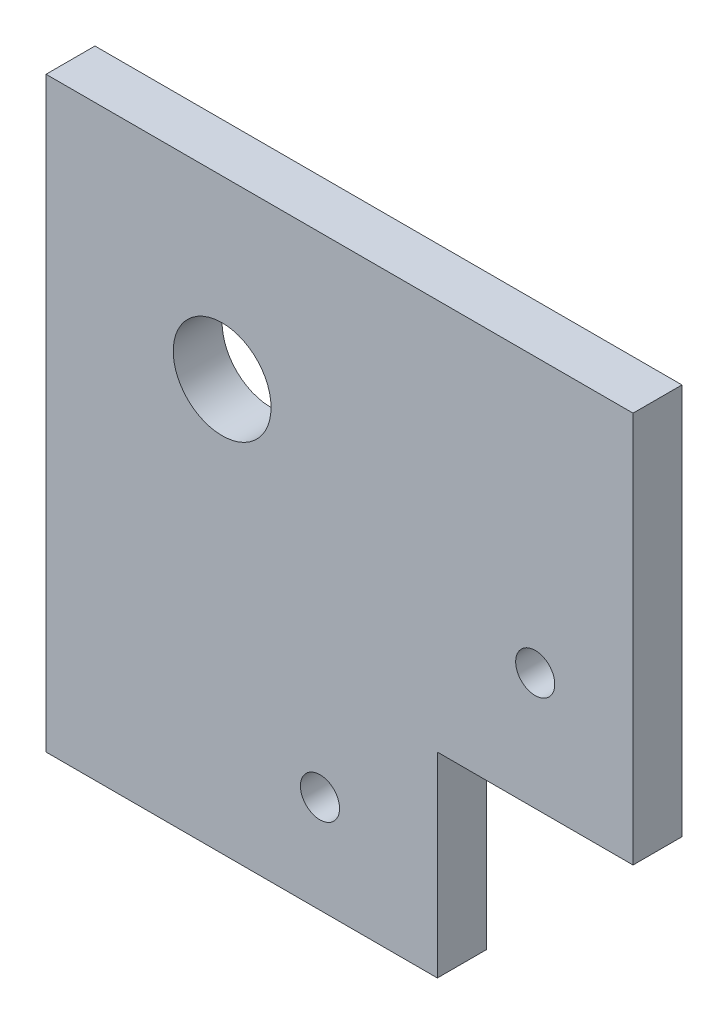
ISO-10303-21;
HEADER;
FILE_DESCRIPTION(('STEP AP214'),'2;1');
FILE_NAME('part.step','',(''),(''),'','','');
FILE_SCHEMA(('AUTOMOTIVE_DESIGN { 1 0 10303 214 1 1 1 1 }'));
ENDSEC;
DATA;
#1=APPLICATION_CONTEXT('core data for automotive mechanical design processes');
#2=APPLICATION_PROTOCOL_DEFINITION('international standard','automotive_design',2000,#1);
#3=PRODUCT_CONTEXT('',#1,'mechanical');
#4=PRODUCT('Part','Part','',(#3));
#5=PRODUCT_RELATED_PRODUCT_CATEGORY('part','',(#4));
#6=PRODUCT_DEFINITION_FORMATION('','',#4);
#7=PRODUCT_DEFINITION_CONTEXT('part definition',#1,'design');
#8=PRODUCT_DEFINITION('design','',#6,#7);
#9=PRODUCT_DEFINITION_SHAPE('','',#8);
#10=(LENGTH_UNIT() NAMED_UNIT(*) SI_UNIT(.MILLI.,.METRE.));
#11=(NAMED_UNIT(*) PLANE_ANGLE_UNIT() SI_UNIT($,.RADIAN.));
#12=(NAMED_UNIT(*) SI_UNIT($,.STERADIAN.) SOLID_ANGLE_UNIT());
#13=UNCERTAINTY_MEASURE_WITH_UNIT(LENGTH_MEASURE(1.E-05),#10,'distance_accuracy_value','');
#14=(GEOMETRIC_REPRESENTATION_CONTEXT(3) GLOBAL_UNCERTAINTY_ASSIGNED_CONTEXT((#13)) GLOBAL_UNIT_ASSIGNED_CONTEXT((#10,
#11,#12)) REPRESENTATION_CONTEXT('',''));
#15=CARTESIAN_POINT('',(0.,0.,0.));
#16=DIRECTION('',(0.,0.,1.));
#17=DIRECTION('',(1.,0.,0.));
#18=AXIS2_PLACEMENT_3D('',#15,#16,#17);
#19=CARTESIAN_POINT('',(0.,0.,5.));
#20=DIRECTION('',(0.,0.,-1.));
#21=DIRECTION('',(-1.,0.,0.));
#22=AXIS2_PLACEMENT_3D('',#19,#20,#21);
#23=PLANE('',#22);
#24=CARTESIAN_POINT('',(50.,32.,5.));
#25=DIRECTION('',(0.,0.,-1.));
#26=DIRECTION('',(-1.,0.,0.));
#27=AXIS2_PLACEMENT_3D('',#24,#25,#26);
#28=CIRCLE('',#27,2.);
#29=CARTESIAN_POINT('',(48.,32.,5.));
#30=VERTEX_POINT('',#29);
#31=EDGE_CURVE('E179',#30,#30,#28,.T.);
#32=ORIENTED_EDGE('',*,*,#31,.T.);
#33=EDGE_LOOP('',(#32));
#34=FACE_BOUND('',#33,.T.);
#35=CARTESIAN_POINT('',(28.,10.,5.));
#36=DIRECTION('',(0.,0.,-1.));
#37=DIRECTION('',(-1.,0.,0.));
#38=AXIS2_PLACEMENT_3D('',#35,#36,#37);
#39=CIRCLE('',#38,2.);
#40=CARTESIAN_POINT('',(26.,10.,5.));
#41=VERTEX_POINT('',#40);
#42=EDGE_CURVE('E183',#41,#41,#39,.T.);
#43=ORIENTED_EDGE('',*,*,#42,.T.);
#44=EDGE_LOOP('',(#43));
#45=FACE_BOUND('',#44,.T.);
#46=DIRECTION('',(0.,-1.,0.));
#47=VECTOR('',#46,1.);
#48=CARTESIAN_POINT('',(0.,0.,5.));
#49=LINE('',#48,#47);
#50=CARTESIAN_POINT('',(0.,60.,5.));
#51=VERTEX_POINT('',#50);
#52=CARTESIAN_POINT('',(0.,0.,5.));
#53=VERTEX_POINT('',#52);
#54=EDGE_CURVE('E132',#51,#53,#49,.T.);
#55=ORIENTED_EDGE('',*,*,#54,.T.);
#56=DIRECTION('',(1.,0.,0.));
#57=VECTOR('',#56,1.);
#58=CARTESIAN_POINT('',(0.,0.,5.));
#59=LINE('',#58,#57);
#60=CARTESIAN_POINT('',(40.,0.,5.));
#61=VERTEX_POINT('',#60);
#62=EDGE_CURVE('E90',#53,#61,#59,.T.);
#63=ORIENTED_EDGE('',*,*,#62,.T.);
#64=DIRECTION('',(0.,1.,0.));
#65=VECTOR('',#64,1.);
#66=CARTESIAN_POINT('',(40.,0.,5.));
#67=LINE('',#66,#65);
#68=CARTESIAN_POINT('',(40.,20.,5.));
#69=VERTEX_POINT('',#68);
#70=EDGE_CURVE('E103',#61,#69,#67,.T.);
#71=ORIENTED_EDGE('',*,*,#70,.T.);
#72=DIRECTION('',(1.,0.,0.));
#73=VECTOR('',#72,1.);
#74=CARTESIAN_POINT('',(60.,20.,5.));
#75=LINE('',#74,#73);
#76=CARTESIAN_POINT('',(60.,20.,5.));
#77=VERTEX_POINT('',#76);
#78=EDGE_CURVE('E97',#69,#77,#75,.T.);
#79=ORIENTED_EDGE('',*,*,#78,.T.);
#80=DIRECTION('',(0.,1.,0.));
#81=VECTOR('',#80,1.);
#82=CARTESIAN_POINT('',(60.,20.,5.));
#83=LINE('',#82,#81);
#84=CARTESIAN_POINT('',(60.,60.,5.));
#85=VERTEX_POINT('',#84);
#86=EDGE_CURVE('E101',#77,#85,#83,.T.);
#87=ORIENTED_EDGE('',*,*,#86,.T.);
#88=DIRECTION('',(-1.,0.,0.));
#89=VECTOR('',#88,1.);
#90=CARTESIAN_POINT('',(0.,60.,5.));
#91=LINE('',#90,#89);
#92=EDGE_CURVE('E53',#85,#51,#91,.T.);
#93=ORIENTED_EDGE('',*,*,#92,.T.);
#94=EDGE_LOOP('',(#55,#63,#71,#79,#87,#93));
#95=FACE_BOUND('',#94,.T.);
#96=CARTESIAN_POINT('',(18.,42.,5.));
#97=DIRECTION('',(0.,0.,1.));
#98=DIRECTION('',(1.,0.,0.));
#99=AXIS2_PLACEMENT_3D('',#96,#97,#98);
#100=CIRCLE('',#99,5.);
#101=CARTESIAN_POINT('',(23.,42.,5.));
#102=VERTEX_POINT('',#101);
#103=EDGE_CURVE('E125',#102,#102,#100,.T.);
#104=ORIENTED_EDGE('',*,*,#103,.F.);
#105=EDGE_LOOP('',(#104));
#106=FACE_BOUND('',#105,.T.);
#107=ADVANCED_FACE('F36',(#34,#45,#95,#106),#23,.F.);
#108=CARTESIAN_POINT('',(0.,0.,0.));
#109=DIRECTION('',(0.,0.,-1.));
#110=DIRECTION('',(-1.,0.,0.));
#111=AXIS2_PLACEMENT_3D('',#108,#109,#110);
#112=PLANE('',#111);
#113=CARTESIAN_POINT('',(50.,32.,0.));
#114=DIRECTION('',(0.,0.,-1.));
#115=DIRECTION('',(-1.,0.,0.));
#116=AXIS2_PLACEMENT_3D('',#113,#114,#115);
#117=CIRCLE('',#116,2.);
#118=CARTESIAN_POINT('',(48.,32.,0.));
#119=VERTEX_POINT('',#118);
#120=EDGE_CURVE('E182',#119,#119,#117,.T.);
#121=ORIENTED_EDGE('',*,*,#120,.F.);
#122=EDGE_LOOP('',(#121));
#123=FACE_BOUND('',#122,.T.);
#124=CARTESIAN_POINT('',(28.,10.,0.));
#125=DIRECTION('',(0.,0.,-1.));
#126=DIRECTION('',(-1.,0.,0.));
#127=AXIS2_PLACEMENT_3D('',#124,#125,#126);
#128=CIRCLE('',#127,2.);
#129=CARTESIAN_POINT('',(26.,10.,0.));
#130=VERTEX_POINT('',#129);
#131=EDGE_CURVE('E188',#130,#130,#128,.T.);
#132=ORIENTED_EDGE('',*,*,#131,.F.);
#133=EDGE_LOOP('',(#132));
#134=FACE_BOUND('',#133,.T.);
#135=DIRECTION('',(0.,-1.,0.));
#136=VECTOR('',#135,1.);
#137=CARTESIAN_POINT('',(0.,0.,0.));
#138=LINE('',#137,#136);
#139=CARTESIAN_POINT('',(0.,60.,0.));
#140=VERTEX_POINT('',#139);
#141=CARTESIAN_POINT('',(0.,0.,0.));
#142=VERTEX_POINT('',#141);
#143=EDGE_CURVE('E121',#140,#142,#138,.T.);
#144=ORIENTED_EDGE('',*,*,#143,.F.);
#145=DIRECTION('',(-1.,0.,0.));
#146=VECTOR('',#145,1.);
#147=CARTESIAN_POINT('',(0.,60.,0.));
#148=LINE('',#147,#146);
#149=CARTESIAN_POINT('',(60.,60.,0.));
#150=VERTEX_POINT('',#149);
#151=EDGE_CURVE('E82',#150,#140,#148,.T.);
#152=ORIENTED_EDGE('',*,*,#151,.F.);
#153=DIRECTION('',(0.,1.,0.));
#154=VECTOR('',#153,1.);
#155=CARTESIAN_POINT('',(60.,20.,0.));
#156=LINE('',#155,#154);
#157=CARTESIAN_POINT('',(60.,20.,0.));
#158=VERTEX_POINT('',#157);
#159=EDGE_CURVE('E76',#158,#150,#156,.T.);
#160=ORIENTED_EDGE('',*,*,#159,.F.);
#161=DIRECTION('',(1.,0.,0.));
#162=VECTOR('',#161,1.);
#163=CARTESIAN_POINT('',(60.,20.,0.));
#164=LINE('',#163,#162);
#165=CARTESIAN_POINT('',(40.,20.,0.));
#166=VERTEX_POINT('',#165);
#167=EDGE_CURVE('E111',#166,#158,#164,.T.);
#168=ORIENTED_EDGE('',*,*,#167,.F.);
#169=DIRECTION('',(0.,1.,0.));
#170=VECTOR('',#169,1.);
#171=CARTESIAN_POINT('',(40.,0.,0.));
#172=LINE('',#171,#170);
#173=CARTESIAN_POINT('',(40.,0.,0.));
#174=VERTEX_POINT('',#173);
#175=EDGE_CURVE('E127',#174,#166,#172,.T.);
#176=ORIENTED_EDGE('',*,*,#175,.F.);
#177=DIRECTION('',(1.,0.,0.));
#178=VECTOR('',#177,1.);
#179=CARTESIAN_POINT('',(0.,0.,0.));
#180=LINE('',#179,#178);
#181=EDGE_CURVE('E124',#142,#174,#180,.T.);
#182=ORIENTED_EDGE('',*,*,#181,.F.);
#183=EDGE_LOOP('',(#144,#152,#160,#168,#176,#182));
#184=FACE_BOUND('',#183,.T.);
#185=CARTESIAN_POINT('',(18.,42.,0.));
#186=DIRECTION('',(0.,0.,1.));
#187=DIRECTION('',(1.,0.,0.));
#188=AXIS2_PLACEMENT_3D('',#185,#186,#187);
#189=CIRCLE('',#188,5.);
#190=CARTESIAN_POINT('',(23.,42.,0.));
#191=VERTEX_POINT('',#190);
#192=EDGE_CURVE('E185',#191,#191,#189,.T.);
#193=ORIENTED_EDGE('',*,*,#192,.T.);
#194=EDGE_LOOP('',(#193));
#195=FACE_BOUND('',#194,.T.);
#196=ADVANCED_FACE('F141',(#123,#134,#184,#195),#112,.T.);
#197=CARTESIAN_POINT('',(0.,0.,5.));
#198=DIRECTION('',(1.,0.,0.));
#199=DIRECTION('',(0.,0.,-1.));
#200=AXIS2_PLACEMENT_3D('',#197,#198,#199);
#201=PLANE('',#200);
#202=ORIENTED_EDGE('',*,*,#143,.T.);
#203=DIRECTION('',(0.,0.,-1.));
#204=VECTOR('',#203,1.);
#205=CARTESIAN_POINT('',(0.,0.,5.));
#206=LINE('',#205,#204);
#207=EDGE_CURVE('E11',#53,#142,#206,.T.);
#208=ORIENTED_EDGE('',*,*,#207,.F.);
#209=ORIENTED_EDGE('',*,*,#54,.F.);
#210=DIRECTION('',(0.,0.,-1.));
#211=VECTOR('',#210,1.);
#212=CARTESIAN_POINT('',(0.,60.,5.));
#213=LINE('',#212,#211);
#214=EDGE_CURVE('E117',#51,#140,#213,.T.);
#215=ORIENTED_EDGE('',*,*,#214,.T.);
#216=EDGE_LOOP('',(#202,#208,#209,#215));
#217=FACE_BOUND('',#216,.T.);
#218=ADVANCED_FACE('F38',(#217),#201,.F.);
#219=CARTESIAN_POINT('',(0.,0.,5.));
#220=DIRECTION('',(0.,1.,0.));
#221=DIRECTION('',(-1.,0.,0.));
#222=AXIS2_PLACEMENT_3D('',#219,#220,#221);
#223=PLANE('',#222);
#224=ORIENTED_EDGE('',*,*,#181,.T.);
#225=DIRECTION('',(0.,0.,-1.));
#226=VECTOR('',#225,1.);
#227=CARTESIAN_POINT('',(40.,0.,5.));
#228=LINE('',#227,#226);
#229=EDGE_CURVE('E45',#61,#174,#228,.T.);
#230=ORIENTED_EDGE('',*,*,#229,.F.);
#231=ORIENTED_EDGE('',*,*,#62,.F.);
#232=ORIENTED_EDGE('',*,*,#207,.T.);
#233=EDGE_LOOP('',(#224,#230,#231,#232));
#234=FACE_BOUND('',#233,.T.);
#235=ADVANCED_FACE('F235',(#234),#223,.F.);
#236=CARTESIAN_POINT('',(40.,0.,5.));
#237=DIRECTION('',(-1.,0.,0.));
#238=DIRECTION('',(0.,0.,1.));
#239=AXIS2_PLACEMENT_3D('',#236,#237,#238);
#240=PLANE('',#239);
#241=ORIENTED_EDGE('',*,*,#175,.T.);
#242=DIRECTION('',(0.,0.,-1.));
#243=VECTOR('',#242,1.);
#244=CARTESIAN_POINT('',(40.,20.,5.));
#245=LINE('',#244,#243);
#246=EDGE_CURVE('E112',#69,#166,#245,.T.);
#247=ORIENTED_EDGE('',*,*,#246,.F.);
#248=ORIENTED_EDGE('',*,*,#70,.F.);
#249=ORIENTED_EDGE('',*,*,#229,.T.);
#250=EDGE_LOOP('',(#241,#247,#248,#249));
#251=FACE_BOUND('',#250,.T.);
#252=ADVANCED_FACE('F138',(#251),#240,.F.);
#253=CARTESIAN_POINT('',(60.,20.,5.));
#254=DIRECTION('',(0.,1.,0.));
#255=DIRECTION('',(-1.,0.,0.));
#256=AXIS2_PLACEMENT_3D('',#253,#254,#255);
#257=PLANE('',#256);
#258=ORIENTED_EDGE('',*,*,#167,.T.);
#259=DIRECTION('',(0.,0.,-1.));
#260=VECTOR('',#259,1.);
#261=CARTESIAN_POINT('',(60.,20.,5.));
#262=LINE('',#261,#260);
#263=EDGE_CURVE('E108',#77,#158,#262,.T.);
#264=ORIENTED_EDGE('',*,*,#263,.F.);
#265=ORIENTED_EDGE('',*,*,#78,.F.);
#266=ORIENTED_EDGE('',*,*,#246,.T.);
#267=EDGE_LOOP('',(#258,#264,#265,#266));
#268=FACE_BOUND('',#267,.T.);
#269=ADVANCED_FACE('F109',(#268),#257,.F.);
#270=CARTESIAN_POINT('',(60.,20.,5.));
#271=DIRECTION('',(-1.,0.,0.));
#272=DIRECTION('',(0.,0.,1.));
#273=AXIS2_PLACEMENT_3D('',#270,#271,#272);
#274=PLANE('',#273);
#275=ORIENTED_EDGE('',*,*,#159,.T.);
#276=DIRECTION('',(0.,0.,-1.));
#277=VECTOR('',#276,1.);
#278=CARTESIAN_POINT('',(60.,60.,5.));
#279=LINE('',#278,#277);
#280=EDGE_CURVE('E113',#85,#150,#279,.T.);
#281=ORIENTED_EDGE('',*,*,#280,.F.);
#282=ORIENTED_EDGE('',*,*,#86,.F.);
#283=ORIENTED_EDGE('',*,*,#263,.T.);
#284=EDGE_LOOP('',(#275,#281,#282,#283));
#285=FACE_BOUND('',#284,.T.);
#286=ADVANCED_FACE('F115',(#285),#274,.F.);
#287=CARTESIAN_POINT('',(0.,60.,5.));
#288=DIRECTION('',(0.,-1.,0.));
#289=DIRECTION('',(0.,0.,-1.));
#290=AXIS2_PLACEMENT_3D('',#287,#288,#289);
#291=PLANE('',#290);
#292=ORIENTED_EDGE('',*,*,#151,.T.);
#293=ORIENTED_EDGE('',*,*,#214,.F.);
#294=ORIENTED_EDGE('',*,*,#92,.F.);
#295=ORIENTED_EDGE('',*,*,#280,.T.);
#296=EDGE_LOOP('',(#292,#293,#294,#295));
#297=FACE_BOUND('',#296,.T.);
#298=ADVANCED_FACE('F146',(#297),#291,.F.);
#299=CARTESIAN_POINT('',(18.,42.,5.));
#300=DIRECTION('',(0.,0.,-1.));
#301=DIRECTION('',(-1.,0.,0.));
#302=AXIS2_PLACEMENT_3D('',#299,#300,#301);
#303=CYLINDRICAL_SURFACE('',#302,5.);
#304=ORIENTED_EDGE('',*,*,#103,.T.);
#305=EDGE_LOOP('',(#304));
#306=FACE_BOUND('',#305,.T.);
#307=ORIENTED_EDGE('',*,*,#192,.F.);
#308=EDGE_LOOP('',(#307));
#309=FACE_BOUND('',#308,.T.);
#310=ADVANCED_FACE('F148',(#306,#309),#303,.F.);
#311=CARTESIAN_POINT('',(28.,10.,5.));
#312=DIRECTION('',(0.,0.,-1.));
#313=DIRECTION('',(-1.,0.,0.));
#314=AXIS2_PLACEMENT_3D('',#311,#312,#313);
#315=CYLINDRICAL_SURFACE('',#314,2.);
#316=ORIENTED_EDGE('',*,*,#42,.F.);
#317=EDGE_LOOP('',(#316));
#318=FACE_BOUND('',#317,.T.);
#319=ORIENTED_EDGE('',*,*,#131,.T.);
#320=EDGE_LOOP('',(#319));
#321=FACE_BOUND('',#320,.T.);
#322=ADVANCED_FACE('F154',(#318,#321),#315,.F.);
#323=CARTESIAN_POINT('',(50.,32.,5.));
#324=DIRECTION('',(0.,0.,-1.));
#325=DIRECTION('',(-1.,0.,0.));
#326=AXIS2_PLACEMENT_3D('',#323,#324,#325);
#327=CYLINDRICAL_SURFACE('',#326,2.);
#328=ORIENTED_EDGE('',*,*,#31,.F.);
#329=EDGE_LOOP('',(#328));
#330=FACE_BOUND('',#329,.T.);
#331=ORIENTED_EDGE('',*,*,#120,.T.);
#332=EDGE_LOOP('',(#331));
#333=FACE_BOUND('',#332,.T.);
#334=ADVANCED_FACE('F171',(#330,#333),#327,.F.);
#335=CLOSED_SHELL('',(#107,#196,#218,#235,#252,#269,#286,#298,#310,#322,#334));
#336=MANIFOLD_SOLID_BREP('B2',#335);
#337=ADVANCED_BREP_SHAPE_REPRESENTATION('',(#18,#336),#14);
#338=SHAPE_DEFINITION_REPRESENTATION(#9,#337);
ENDSEC;
END-ISO-10303-21;
